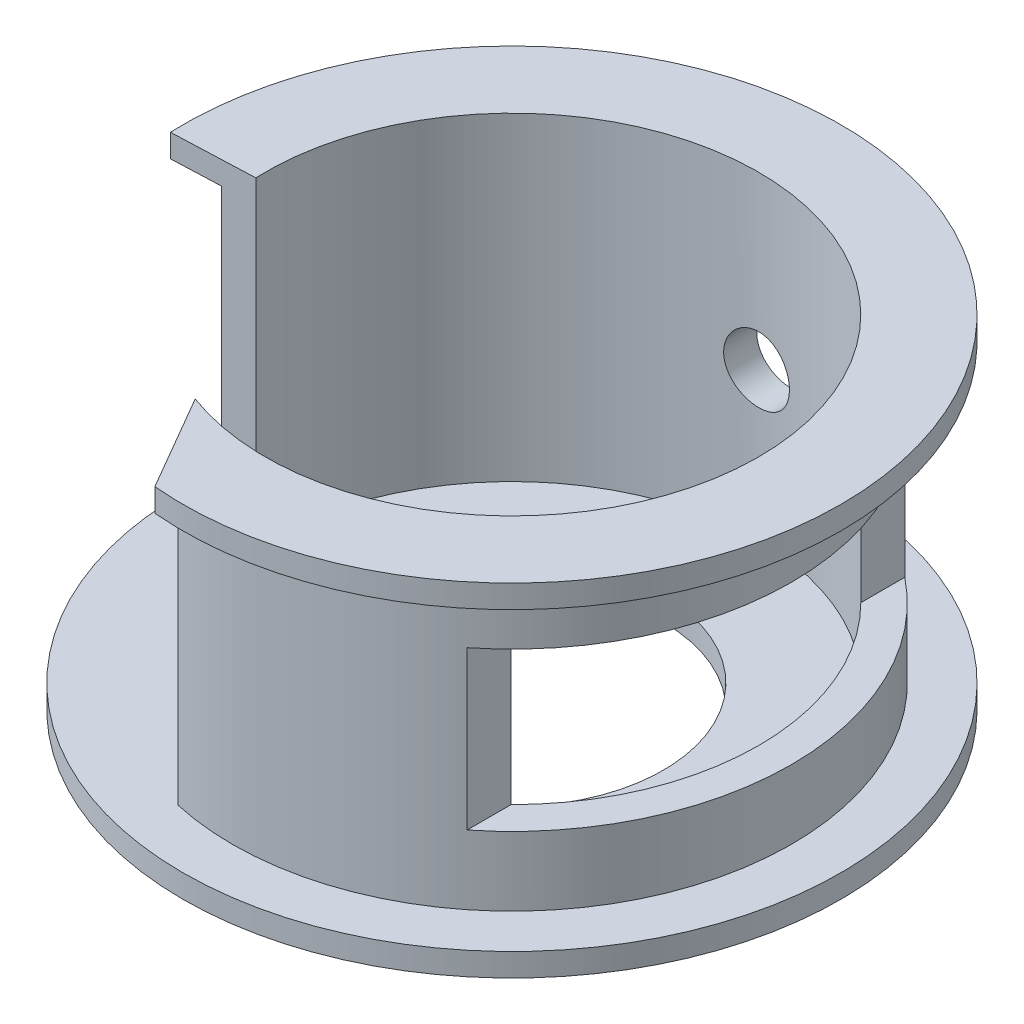
ISO-10303-21;
HEADER;
FILE_DESCRIPTION(('STEP AP214'),'2;1');
FILE_NAME('part.step','',(''),(''),'','','');
FILE_SCHEMA(('AUTOMOTIVE_DESIGN { 1 0 10303 214 1 1 1 1 }'));
ENDSEC;
DATA;
#1=APPLICATION_CONTEXT('core data for automotive mechanical design processes');
#2=APPLICATION_PROTOCOL_DEFINITION('international standard','automotive_design',2000,#1);
#3=PRODUCT_CONTEXT('',#1,'mechanical');
#4=PRODUCT('Part','Part','',(#3));
#5=PRODUCT_RELATED_PRODUCT_CATEGORY('part','',(#4));
#6=PRODUCT_DEFINITION_FORMATION('','',#4);
#7=PRODUCT_DEFINITION_CONTEXT('part definition',#1,'design');
#8=PRODUCT_DEFINITION('design','',#6,#7);
#9=PRODUCT_DEFINITION_SHAPE('','',#8);
#10=(LENGTH_UNIT() NAMED_UNIT(*) SI_UNIT(.MILLI.,.METRE.));
#11=(NAMED_UNIT(*) PLANE_ANGLE_UNIT() SI_UNIT($,.RADIAN.));
#12=(NAMED_UNIT(*) SI_UNIT($,.STERADIAN.) SOLID_ANGLE_UNIT());
#13=UNCERTAINTY_MEASURE_WITH_UNIT(LENGTH_MEASURE(1.E-05),#10,'distance_accuracy_value','');
#14=(GEOMETRIC_REPRESENTATION_CONTEXT(3) GLOBAL_UNCERTAINTY_ASSIGNED_CONTEXT((#13)) GLOBAL_UNIT_ASSIGNED_CONTEXT((#10,
#11,#12)) REPRESENTATION_CONTEXT('',''));
#15=CARTESIAN_POINT('',(0.,0.,0.));
#16=DIRECTION('',(0.,0.,1.));
#17=DIRECTION('',(1.,0.,0.));
#18=AXIS2_PLACEMENT_3D('',#15,#16,#17);
#19=CARTESIAN_POINT('',(-49.6227740453213,4.85,6.0186037827246));
#20=DIRECTION('',(0.,-1.,0.));
#21=DIRECTION('',(0.,0.,-1.));
#22=AXIS2_PLACEMENT_3D('',#19,#20,#21);
#23=CYLINDRICAL_SURFACE('',#22,4.25000000000001);
#24=DIRECTION('',(0.,-1.,0.));
#25=VECTOR('',#24,1.);
#26=CARTESIAN_POINT('',(-46.9777088050411,4.85,9.34518308805638));
#27=LINE('',#26,#25);
#28=CARTESIAN_POINT('',(-46.9777088050411,1.4,9.34518308805638));
#29=VERTEX_POINT('',#28);
#30=CARTESIAN_POINT('',(-46.9777088050411,3.8,9.34518308805638));
#31=VERTEX_POINT('',#30);
#32=EDGE_CURVE('E200',#29,#31,#27,.F.);
#33=ORIENTED_EDGE('',*,*,#32,.T.);
#34=CARTESIAN_POINT('',(-49.6227740453213,3.8,6.0186037827246));
#35=DIRECTION('',(0.,1.,0.));
#36=DIRECTION('',(0.,0.,1.));
#37=AXIS2_PLACEMENT_3D('',#34,#35,#36);
#38=CIRCLE('',#37,4.25000000000001);
#39=CARTESIAN_POINT('',(-46.9777088050411,3.8,2.69202447739283));
#40=VERTEX_POINT('',#39);
#41=EDGE_CURVE('E220',#31,#40,#38,.T.);
#42=ORIENTED_EDGE('',*,*,#41,.T.);
#43=DIRECTION('',(0.,-1.,0.));
#44=VECTOR('',#43,1.);
#45=CARTESIAN_POINT('',(-46.9777088050411,4.85,2.69202447739283));
#46=LINE('',#45,#44);
#47=CARTESIAN_POINT('',(-46.9777088050411,1.4,2.69202447739283));
#48=VERTEX_POINT('',#47);
#49=EDGE_CURVE('E217',#40,#48,#46,.T.);
#50=ORIENTED_EDGE('',*,*,#49,.T.);
#51=CARTESIAN_POINT('',(-49.6227740453213,1.4,6.0186037827246));
#52=DIRECTION('',(0.,1.,0.));
#53=DIRECTION('',(0.,0.,1.));
#54=AXIS2_PLACEMENT_3D('',#51,#52,#53);
#55=CIRCLE('',#54,4.25000000000001);
#56=EDGE_CURVE('E212',#29,#48,#55,.T.);
#57=ORIENTED_EDGE('',*,*,#56,.F.);
#58=EDGE_LOOP('',(#33,#42,#50,#57));
#59=FACE_BOUND('',#58,.T.);
#60=DIRECTION('',(0.,-1.,0.));
#61=VECTOR('',#60,1.);
#62=CARTESIAN_POINT('',(-50.5545924150655,4.85,10.165194493876));
#63=LINE('',#62,#61);
#64=CARTESIAN_POINT('',(-50.5545924150655,0.35,10.165194493876));
#65=VERTEX_POINT('',#64);
#66=CARTESIAN_POINT('',(-50.5545924150655,4.85,10.165194493876));
#67=VERTEX_POINT('',#66);
#68=EDGE_CURVE('E208',#65,#67,#63,.F.);
#69=ORIENTED_EDGE('',*,*,#68,.F.);
#70=CARTESIAN_POINT('',(-49.6227740453213,0.35,6.0186037827246));
#71=DIRECTION('',(0.,1.,0.));
#72=DIRECTION('',(0.,0.,1.));
#73=AXIS2_PLACEMENT_3D('',#70,#71,#72);
#74=CIRCLE('',#73,4.25000000000001);
#75=CARTESIAN_POINT('',(-53.8695061417575,0.35,6.1852366159187));
#76=VERTEX_POINT('',#75);
#77=EDGE_CURVE('E234',#65,#76,#74,.T.);
#78=ORIENTED_EDGE('',*,*,#77,.T.);
#79=DIRECTION('',(0.,-1.,0.));
#80=VECTOR('',#79,1.);
#81=CARTESIAN_POINT('',(-53.8695061417575,4.85,6.1852366159187));
#82=LINE('',#81,#80);
#83=CARTESIAN_POINT('',(-53.8695061417575,4.85,6.1852366159187));
#84=VERTEX_POINT('',#83);
#85=EDGE_CURVE('E140',#84,#76,#82,.T.);
#86=ORIENTED_EDGE('',*,*,#85,.F.);
#87=CARTESIAN_POINT('',(-49.6227740453213,4.85,6.0186037827246));
#88=DIRECTION('',(0.,1.,0.));
#89=DIRECTION('',(0.,0.,1.));
#90=AXIS2_PLACEMENT_3D('',#87,#88,#89);
#91=CIRCLE('',#90,4.25000000000001);
#92=EDGE_CURVE('E238',#67,#84,#91,.T.);
#93=ORIENTED_EDGE('',*,*,#92,.F.);
#94=EDGE_LOOP('',(#69,#78,#86,#93));
#95=FACE_BOUND('',#94,.T.);
#96=CARTESIAN_POINT('',(-50.1211400935394,2.6,1.79792477550509));
#97=CARTESIAN_POINT('',(-50.1211388964455,2.62798156670538,1.79792439509741));
#98=CARTESIAN_POINT('',(-50.1187832699592,2.65598094317943,1.79764442398657));
#99=CARTESIAN_POINT('',(-50.1094229075103,2.71120142448625,1.79655520055126));
#100=CARTESIAN_POINT('',(-50.1024132294114,2.73842166987362,1.79574538559905));
#101=CARTESIAN_POINT('',(-50.0839533994304,2.79127636042462,1.79368966404153));
#102=CARTESIAN_POINT('',(-50.0725061533573,2.81691183062037,1.79244404286284));
#103=CARTESIAN_POINT('',(-50.0455021312225,2.86589278743226,1.78965777455389));
#104=CARTESIAN_POINT('',(-50.0299460942458,2.88923868485963,1.78811718049675));
#105=CARTESIAN_POINT('',(-49.9950835702785,2.93309825790554,1.78490652151593));
#106=CARTESIAN_POINT('',(-49.9757608395914,2.953598983719,1.78323591537095));
#107=CARTESIAN_POINT('',(-49.9339483134657,2.99107448524386,1.77995901829016));
#108=CARTESIAN_POINT('',(-49.9114583653892,3.00804909092291,1.77835273045883));
#109=CARTESIAN_POINT('',(-49.8638695171569,3.03803610608421,1.77538070160866));
#110=CARTESIAN_POINT('',(-49.8387632839979,3.05103695421215,1.77401566726835));
#111=CARTESIAN_POINT('',(-49.7867052004623,3.07263329471565,1.77168670212908));
#112=CARTESIAN_POINT('',(-49.7597534112858,3.08122893309135,1.77072275803714));
#113=CARTESIAN_POINT('',(-49.7049023200967,3.09373216075166,1.76930928482792));
#114=CARTESIAN_POINT('',(-49.6770080080902,3.09766136862938,1.76885738397281));
#115=CARTESIAN_POINT('',(-49.6209525378693,3.10078727683943,1.76851177509801));
#116=CARTESIAN_POINT('',(-49.592791389005,3.09998414238909,1.76861804759115));
#117=CARTESIAN_POINT('',(-49.5371474433777,3.09368554040608,1.76937575921598));
#118=CARTESIAN_POINT('',(-49.5096619942383,3.08821313836785,1.7700245182299));
#119=CARTESIAN_POINT('',(-49.4560024483463,3.07276747012506,1.77179222962535));
#120=CARTESIAN_POINT('',(-49.42982837442,3.06279412560563,1.7729111901882));
#121=CARTESIAN_POINT('',(-49.3794611328486,3.03860427463275,1.77549914268959));
#122=CARTESIAN_POINT('',(-49.3552729520261,3.02437747905306,1.77696898164759));
#123=CARTESIAN_POINT('',(-49.3096187278496,2.99209206217626,1.78009482717716));
#124=CARTESIAN_POINT('',(-49.2881527954743,2.97403328473981,1.7817508413334));
#125=CARTESIAN_POINT('',(-49.2484158699745,2.93446602826488,1.78507608331743));
#126=CARTESIAN_POINT('',(-49.2301650491519,2.91293728602694,1.78674533036021));
#127=CARTESIAN_POINT('',(-49.197533053571,2.86711101182972,1.78989952342807));
#128=CARTESIAN_POINT('',(-49.1831518880008,2.84281347329642,1.79138446901552));
#129=CARTESIAN_POINT('',(-49.1586671066332,2.7921228909608,1.79400236232324));
#130=CARTESIAN_POINT('',(-49.1485648641116,2.7657291776355,1.79513519700617));
#131=CARTESIAN_POINT('',(-49.1329414206458,2.71160367044555,1.79691852746226));
#132=CARTESIAN_POINT('',(-49.1274200236129,2.68387193391039,1.79756904388152));
#133=CARTESIAN_POINT('',(-49.121141607089,2.62803632859877,1.79831054565642));
#134=CARTESIAN_POINT('',(-49.1203561053472,2.5999357051872,1.79840487590752));
#135=CARTESIAN_POINT('',(-49.1234967383997,2.54400325586424,1.7980321895262));
#136=CARTESIAN_POINT('',(-49.1274227839295,2.51617142487041,1.7975651835288));
#137=CARTESIAN_POINT('',(-49.1398511691961,2.46165105516719,1.7961253590766));
#138=CARTESIAN_POINT('',(-49.1483398468639,2.4349593587621,1.79515405096754));
#139=CARTESIAN_POINT('',(-49.1696384926664,2.38337836300969,1.79281601292121));
#140=CARTESIAN_POINT('',(-49.1824485966325,2.35848912034712,1.7914492705548));
#141=CARTESIAN_POINT('',(-49.2120967707017,2.31109058148161,1.78846591719097));
#142=CARTESIAN_POINT('',(-49.2289535496515,2.28859306122958,1.78684815833991));
#143=CARTESIAN_POINT('',(-49.266189978899,2.24673648396853,1.78354814231527));
#144=CARTESIAN_POINT('',(-49.2865697512347,2.22737753572604,1.78186588290893));
#145=CARTESIAN_POINT('',(-49.3303979326084,2.19224800738869,1.77861550581908));
#146=CARTESIAN_POINT('',(-49.3538613810926,2.17649612497319,1.77704801032022));
#147=CARTESIAN_POINT('',(-49.4031173818225,2.14915696006322,1.77421234740412));
#148=CARTESIAN_POINT('',(-49.4289098921275,2.13756960259467,1.7729441745983));
#149=CARTESIAN_POINT('',(-49.4820298756929,2.11891911964686,1.7708519868734));
#150=CARTESIAN_POINT('',(-49.5093535207753,2.11184521433279,1.77002691441516));
#151=CARTESIAN_POINT('',(-49.5648111149409,2.10238748990435,1.76890860835077));
#152=CARTESIAN_POINT('',(-49.5929450317264,2.10000348411145,1.768615353576));
#153=CARTESIAN_POINT('',(-49.6490425298429,2.09999654443786,1.76859295596488));
#154=CARTESIAN_POINT('',(-49.6770061106065,2.10234485651214,1.76886040662354));
#155=CARTESIAN_POINT('',(-49.7321385081036,2.11167529508503,1.76992164723604));
#156=CARTESIAN_POINT('',(-49.7593073251673,2.11865741965878,1.77071543697123));
#157=CARTESIAN_POINT('',(-49.8120750874979,2.13704828026223,1.7727396012217));
#158=CARTESIAN_POINT('',(-49.8376745236463,2.14845562387673,1.77396983839642));
#159=CARTESIAN_POINT('',(-49.8866002206707,2.17537016582407,1.77672956459788));
#160=CARTESIAN_POINT('',(-49.9099264675238,2.19087738944622,1.77825905547048));
#161=CARTESIAN_POINT('',(-49.9537896133389,2.22565757867586,1.78145664258483));
#162=CARTESIAN_POINT('',(-49.9743096075365,2.24495179576592,1.78312548898797));
#163=CARTESIAN_POINT('',(-50.0118322544799,2.28671459849814,1.78640701973318));
#164=CARTESIAN_POINT('',(-50.0288340697299,2.30918393783485,1.78801969062696));
#165=CARTESIAN_POINT('',(-50.0588869601394,2.35674697244112,1.79101166784557));
#166=CARTESIAN_POINT('',(-50.0719242130763,2.38184944810893,1.79239015048053));
#167=CARTESIAN_POINT('',(-50.0935801909538,2.43388885974119,1.79474756996055));
#168=CARTESIAN_POINT('',(-50.1022037765569,2.46082374051302,1.79572694608834));
#169=CARTESIAN_POINT('',(-50.1126959553758,2.50658524582692,1.79693428164283));
#170=CARTESIAN_POINT('',(-50.1158580273617,2.52512194778828,1.79730389283449));
#171=CARTESIAN_POINT('',(-50.1200804915823,2.5624364250665,1.79779926668373));
#172=CARTESIAN_POINT('',(-50.1211408972245,2.58121419884469,1.79792503089691));
#173=CARTESIAN_POINT('',(-50.1211400935394,2.6,1.79792477550509));
#174=B_SPLINE_CURVE_WITH_KNOTS('',3,(#96,#97,#98,#99,#100,#101,#102,#103,#104,#105,#106,#107,
#108,#109,#110,#111,#112,#113,#114,#115,#116,#117,#118,#119,#120,#121,#122,#123,#124,#125,#126,
#127,#128,#129,#130,#131,#132,#133,#134,#135,#136,#137,#138,#139,#140,#141,#142,#143,#144,#145,
#146,#147,#148,#149,#150,#151,#152,#153,#154,#155,#156,#157,#158,#159,#160,#161,#162,#163,#164,
#165,#166,#167,#168,#169,#170,#171,#172,#173),.UNSPECIFIED.,.T.,.F.,(4,2,2,2,2,2,2,2,2,2,2,2,2,
2,2,2,2,2,2,2,2,2,2,2,2,2,2,2,2,2,2,2,2,2,2,2,2,2,4),(0.,0.0838760829430994,0.167841376638751,
0.251751780792326,0.335647101499644,0.419912557239273,0.504182075384611,0.588694485577215,
0.673204094627054,0.757320641857373,0.84143425239642,0.925134743829644,1.00883669167932,
1.09274277626633,1.17665228037852,1.26107082646947,1.34548957300176,1.42993539235923,
1.5143775967246,1.5983114447186,1.68224370253551,1.76592602748241,1.84961098298448,
1.93369055097871,2.01777303210926,2.10228196766754,2.18678938173239,2.27109419697227,
2.35539565644379,2.43918643614964,2.52297718104945,2.60674158216928,2.6905064999855,
2.77475566230037,2.85902485695747,2.94358456915207,3.02805095636651,3.08436265201015,
3.14067398841408),.UNSPECIFIED.);
#175=CARTESIAN_POINT('',(-50.1211400935394,2.6,1.79792477550509));
#176=VERTEX_POINT('',#175);
#177=EDGE_CURVE('E273',#176,#176,#174,.T.);
#178=ORIENTED_EDGE('',*,*,#177,.F.);
#179=EDGE_LOOP('',(#178));
#180=FACE_BOUND('',#179,.T.);
#181=ADVANCED_FACE('F51',(#59,#95,#180),#23,.T.);
#182=CARTESIAN_POINT('',(-49.6227740453213,4.85,6.0186037827246));
#183=DIRECTION('',(0.,-1.,0.));
#184=DIRECTION('',(0.,0.,-1.));
#185=AXIS2_PLACEMENT_3D('',#182,#183,#184);
#186=CYLINDRICAL_SURFACE('',#185,3.75000000000001);
#187=CARTESIAN_POINT('',(-49.6227740453213,0.35,6.0186037827246));
#188=DIRECTION('',(0.,1.,0.));
#189=DIRECTION('',(0.,0.,1.));
#190=AXIS2_PLACEMENT_3D('',#187,#188,#189);
#191=CIRCLE('',#190,3.75000000000001);
#192=CARTESIAN_POINT('',(-53.3698906010003,0.35,6.16563275318998));
#193=VERTEX_POINT('',#192);
#194=CARTESIAN_POINT('',(-50.9188461799765,0.35,9.53750943956883));
#195=VERTEX_POINT('',#194);
#196=EDGE_CURVE('E151',#193,#195,#191,.F.);
#197=ORIENTED_EDGE('',*,*,#196,.T.);
#198=DIRECTION('',(0.,1.,0.));
#199=VECTOR('',#198,1.);
#200=CARTESIAN_POINT('',(-50.9188461799765,0.35,9.53750943956883));
#201=LINE('',#200,#199);
#202=CARTESIAN_POINT('',(-50.9188461799765,5.2,9.53750943956883));
#203=VERTEX_POINT('',#202);
#204=EDGE_CURVE('E143',#195,#203,#201,.T.);
#205=ORIENTED_EDGE('',*,*,#204,.T.);
#206=CARTESIAN_POINT('',(-49.6227740453213,5.2,6.0186037827246));
#207=DIRECTION('',(0.,1.,0.));
#208=DIRECTION('',(0.,0.,1.));
#209=AXIS2_PLACEMENT_3D('',#206,#207,#208);
#210=CIRCLE('',#209,3.75000000000001);
#211=CARTESIAN_POINT('',(-53.3698906010003,5.2,6.16563275318998));
#212=VERTEX_POINT('',#211);
#213=EDGE_CURVE('E153',#203,#212,#210,.T.);
#214=ORIENTED_EDGE('',*,*,#213,.T.);
#215=DIRECTION('',(0.,1.,0.));
#216=VECTOR('',#215,1.);
#217=CARTESIAN_POINT('',(-53.3698906010003,0.35,6.16563275318998));
#218=LINE('',#217,#216);
#219=EDGE_CURVE('E137',#193,#212,#218,.T.);
#220=ORIENTED_EDGE('',*,*,#219,.F.);
#221=EDGE_LOOP('',(#197,#205,#214,#220));
#222=FACE_BOUND('',#221,.T.);
#223=CARTESIAN_POINT('',(-49.6227740453213,3.8,6.0186037827246));
#224=DIRECTION('',(0.,1.,0.));
#225=DIRECTION('',(0.,0.,1.));
#226=AXIS2_PLACEMENT_3D('',#223,#224,#225);
#227=CIRCLE('',#226,3.75000000000001);
#228=CARTESIAN_POINT('',(-46.9777088050411,3.8,8.67682308794786));
#229=VERTEX_POINT('',#228);
#230=CARTESIAN_POINT('',(-46.9777088050411,3.8,3.36038447750135));
#231=VERTEX_POINT('',#230);
#232=EDGE_CURVE('E12',#229,#231,#227,.T.);
#233=ORIENTED_EDGE('',*,*,#232,.F.);
#234=DIRECTION('',(0.,-1.,0.));
#235=VECTOR('',#234,1.);
#236=CARTESIAN_POINT('',(-46.9777088050411,4.85,8.67682308794786));
#237=LINE('',#236,#235);
#238=CARTESIAN_POINT('',(-46.9777088050411,1.4,8.67682308794786));
#239=VERTEX_POINT('',#238);
#240=EDGE_CURVE('E166',#239,#229,#237,.F.);
#241=ORIENTED_EDGE('',*,*,#240,.F.);
#242=CARTESIAN_POINT('',(-49.6227740453213,1.4,6.0186037827246));
#243=DIRECTION('',(0.,1.,0.));
#244=DIRECTION('',(0.,0.,1.));
#245=AXIS2_PLACEMENT_3D('',#242,#243,#244);
#246=CIRCLE('',#245,3.75000000000001);
#247=CARTESIAN_POINT('',(-46.9777088050411,1.4,3.36038447750135));
#248=VERTEX_POINT('',#247);
#249=EDGE_CURVE('E160',#239,#248,#246,.T.);
#250=ORIENTED_EDGE('',*,*,#249,.T.);
#251=DIRECTION('',(0.,-1.,0.));
#252=VECTOR('',#251,1.);
#253=CARTESIAN_POINT('',(-46.9777088050411,4.85,3.36038447750135));
#254=LINE('',#253,#252);
#255=EDGE_CURVE('E66',#231,#248,#254,.T.);
#256=ORIENTED_EDGE('',*,*,#255,.F.);
#257=EDGE_LOOP('',(#233,#241,#250,#256));
#258=FACE_BOUND('',#257,.T.);
#259=CARTESIAN_POINT('',(-50.1211400935394,2.6,2.30186713857244));
#260=CARTESIAN_POINT('',(-50.1211389151966,2.6279520108603,2.30186671462601));
#261=CARTESIAN_POINT('',(-50.1187882365882,2.65592110227072,2.30154944284697));
#262=CARTESIAN_POINT('',(-50.1094486936465,2.71107980505658,2.30031531607637));
#263=CARTESIAN_POINT('',(-50.1024550839288,2.73826858921525,2.29939784765795));
#264=CARTESIAN_POINT('',(-50.0840404194912,2.79106017833969,2.29706929985386));
#265=CARTESIAN_POINT('',(-50.0726224851241,2.8166640863475,2.29565856842116));
#266=CARTESIAN_POINT('',(-50.045690148999,2.86558807973306,2.29250328284264));
#267=CARTESIAN_POINT('',(-50.0301764054277,2.88890853123203,2.29075878234508));
#268=CARTESIAN_POINT('',(-49.9953879980248,2.93275525296693,2.2871207603201));
#269=CARTESIAN_POINT('',(-49.9760926133458,2.95326501986763,2.28522645370699));
#270=CARTESIAN_POINT('',(-49.9343332814444,2.99076543197651,2.28151007531922));
#271=CARTESIAN_POINT('',(-49.9118691725712,3.00775589754022,2.27968800723586));
#272=CARTESIAN_POINT('',(-49.864306344825,3.03779468443482,2.27631413827661));
#273=CARTESIAN_POINT('',(-49.8391981284975,3.05082809338158,2.27476336888033));
#274=CARTESIAN_POINT('',(-49.7871250740251,3.07248710864644,2.27211641239256));
#275=CARTESIAN_POINT('',(-49.7601603141413,3.08111290063504,2.27102020615299));
#276=CARTESIAN_POINT('',(-49.705310112481,3.09366201967094,2.26941243954968));
#277=CARTESIAN_POINT('',(-49.6774311128773,3.0976130561837,2.26889743498053));
#278=CARTESIAN_POINT('',(-49.6214014212377,3.1007865792582,2.26849941498346));
#279=CARTESIAN_POINT('',(-49.5932507412661,3.10000927483399,2.26861637161997));
#280=CARTESIAN_POINT('',(-49.5376639627132,3.09377025786257,2.26946729744685));
#281=CARTESIAN_POINT('',(-49.5102244776239,3.08833811332933,2.27019737147065));
#282=CARTESIAN_POINT('',(-49.4566502106328,3.07299003627458,2.27218923981854));
#283=CARTESIAN_POINT('',(-49.4305154567998,3.0630740073374,2.27345104557628));
#284=CARTESIAN_POINT('',(-49.3801995648099,3.03900776032899,2.27637244981885));
#285=CARTESIAN_POINT('',(-49.3560247120226,3.02484455495021,2.27803326528045));
#286=CARTESIAN_POINT('',(-49.3103836892616,2.99269546629325,2.28156791706812));
#287=CARTESIAN_POINT('',(-49.288917661027,2.97470938311515,2.28344176453134));
#288=CARTESIAN_POINT('',(-49.2491282319096,2.93525829605044,2.28721099445868));
#289=CARTESIAN_POINT('',(-49.2308306135087,2.91376728397405,2.28910643097042));
#290=CARTESIAN_POINT('',(-49.1980981426176,2.8680053947996,2.29269149696412));
#291=CARTESIAN_POINT('',(-49.1836633047084,2.84373450720877,2.2943811256692));
#292=CARTESIAN_POINT('',(-49.1590646005676,2.79307860206708,2.29736367956865));
#293=CARTESIAN_POINT('',(-49.1489028224093,2.76669255840489,2.29865641073201));
#294=CARTESIAN_POINT('',(-49.133161811128,2.71256733980498,2.3006953058));
#295=CARTESIAN_POINT('',(-49.1275823238206,2.68482824001311,2.30144150002135));
#296=CARTESIAN_POINT('',(-49.1211989704825,2.62901374278629,2.3022974301501));
#297=CARTESIAN_POINT('',(-49.1203585496954,2.60094259795307,2.30241203764082));
#298=CARTESIAN_POINT('',(-49.1233805668057,2.54505989866844,2.30200474768835));
#299=CARTESIAN_POINT('',(-49.1272428895426,2.51724833787715,2.30148286583147));
#300=CARTESIAN_POINT('',(-49.1395299566415,2.46278475741031,2.29986570248506));
#301=CARTESIAN_POINT('',(-49.1479368769516,2.4361286443147,2.29877266165376));
#302=CARTESIAN_POINT('',(-49.1690560715684,2.38460426488183,2.29613785590929));
#303=CARTESIAN_POINT('',(-49.1817685173575,2.35973606980246,2.29459607312374));
#304=CARTESIAN_POINT('',(-49.2112269548803,2.31232880040082,2.29122544469352));
#305=CARTESIAN_POINT('',(-49.2279967803717,2.28980465709672,2.2893949259393));
#306=CARTESIAN_POINT('',(-49.2650603889288,2.2478775418161,2.28565762814116));
#307=CARTESIAN_POINT('',(-49.2853543295631,2.22847470947312,2.2837508456903));
#308=CARTESIAN_POINT('',(-49.3290503328005,2.19321149879059,2.28006003676669));
#309=CARTESIAN_POINT('',(-49.3524719416436,2.1773752343872,2.27827689920379));
#310=CARTESIAN_POINT('',(-49.4016639348582,2.14986183557175,2.27504704635353));
#311=CARTESIAN_POINT('',(-49.4274342668721,2.13818460847503,2.27360032356937));
#312=CARTESIAN_POINT('',(-49.480515019867,2.11935963318402,2.2712092907869));
#313=CARTESIAN_POINT('',(-49.507820593368,2.11219841406884,2.27026348794593));
#314=CARTESIAN_POINT('',(-49.5632601907741,2.10256518564769,2.268973608166));
#315=CARTESIAN_POINT('',(-49.5913941717081,2.10009293354941,2.26862950007167));
#316=CARTESIAN_POINT('',(-49.6474581421567,2.09991291808314,2.26858105120731));
#317=CARTESIAN_POINT('',(-49.6753880159333,2.1021682389315,2.26887175418419));
#318=CARTESIAN_POINT('',(-49.7304680771547,2.11130100991402,2.27004925069771));
#319=CARTESIAN_POINT('',(-49.7576182659357,2.11817845212651,2.27093604321275));
#320=CARTESIAN_POINT('',(-49.8103601963518,2.13634778638291,2.27320548389206));
#321=CARTESIAN_POINT('',(-49.8359527240316,2.14763743018314,2.27458787949147));
#322=CARTESIAN_POINT('',(-49.8848859686813,2.17430690148608,2.27769491386198));
#323=CARTESIAN_POINT('',(-49.9082266445823,2.18968680356669,2.2794195588732));
#324=CARTESIAN_POINT('',(-49.9521803949902,2.2242348053358,2.28303392958083));
#325=CARTESIAN_POINT('',(-49.9727719979714,2.24343010607265,2.28492478284778));
#326=CARTESIAN_POINT('',(-50.0104558686444,2.28500713722485,2.28864904636827));
#327=CARTESIAN_POINT('',(-50.027547309151,2.30738961874526,2.29048244295669));
#328=CARTESIAN_POINT('',(-50.0578114908178,2.35482002243566,2.29389223938027));
#329=CARTESIAN_POINT('',(-50.070966599987,2.37987927489756,2.29546746898657));
#330=CARTESIAN_POINT('',(-50.0928627097426,2.4318589355152,2.29816839957442));
#331=CARTESIAN_POINT('',(-50.1016084404064,2.45877731392021,2.29929458199034));
#332=CARTESIAN_POINT('',(-50.1123780135959,2.50485785837602,2.30070030734142));
#333=CARTESIAN_POINT('',(-50.11565897696,2.52373119641663,2.30113564148204));
#334=CARTESIAN_POINT('',(-50.1200404104307,2.5617336890911,2.30171920092356));
#335=CARTESIAN_POINT('',(-50.121140900284,2.58086284140666,2.30186742882454));
#336=CARTESIAN_POINT('',(-50.1211400935394,2.6,2.30186713857244));
#337=B_SPLINE_CURVE_WITH_KNOTS('',3,(#259,#260,#261,#262,#263,#264,#265,#266,#267,#268,#269,
#270,#271,#272,#273,#274,#275,#276,#277,#278,#279,#280,#281,#282,#283,#284,#285,#286,#287,#288,
#289,#290,#291,#292,#293,#294,#295,#296,#297,#298,#299,#300,#301,#302,#303,#304,#305,#306,#307,
#308,#309,#310,#311,#312,#313,#314,#315,#316,#317,#318,#319,#320,#321,#322,#323,#324,#325,#326,
#327,#328,#329,#330,#331,#332,#333,#334,#335,#336),.UNSPECIFIED.,.T.,.F.,(4,2,2,2,2,2,2,2,2,2,2,
2,2,2,2,2,2,2,2,2,2,2,2,2,2,2,2,2,2,2,2,2,2,2,2,2,2,2,4),(0.,0.0837861130459666,
0.167657993181496,0.251470828169377,0.335270202827333,0.419542270061261,0.503818637944873,
0.588408772564847,0.672995343538438,0.757077977593079,0.841156894842045,0.92470566011824,
1.00825622200489,1.09206492193822,1.17587800534293,1.26034396297329,1.34481023943494,
1.42931774335409,1.51382055923895,1.59767066220612,1.68151871189942,1.76504026793901,
1.84856515090673,1.93259312305632,2.0166248531978,2.10120872695184,2.18579071562591,
2.27011919391793,2.35444330560543,2.43811141669216,2.52177938438378,2.60540477441063,
2.6890316892883,2.77327769205354,2.85754358156189,2.94218145907335,3.02672834868838,
3.08409247402628,3.14145607986108),.UNSPECIFIED.);
#338=CARTESIAN_POINT('',(-50.1211400935394,2.6,2.30186713857244));
#339=VERTEX_POINT('',#338);
#340=EDGE_CURVE('E55',#339,#339,#337,.T.);
#341=ORIENTED_EDGE('',*,*,#340,.T.);
#342=EDGE_LOOP('',(#341));
#343=FACE_BOUND('',#342,.T.);
#344=ADVANCED_FACE('F148',(#222,#258,#343),#186,.F.);
#345=CARTESIAN_POINT('',(-49.6227740453213,5.2,6.0186037827246));
#346=DIRECTION('',(0.,1.,0.));
#347=DIRECTION('',(0.,0.,1.));
#348=AXIS2_PLACEMENT_3D('',#345,#346,#347);
#349=PLANE('',#348);
#350=ORIENTED_EDGE('',*,*,#213,.F.);
#351=DIRECTION('',(0.501920615587482,0.,0.864913692600761));
#352=VECTOR('',#351,1.);
#353=CARTESIAN_POINT('',(-42.231555924761,5.2,24.5075187597447));
#354=LINE('',#353,#352);
#355=CARTESIAN_POINT('',(-50.0710320086338,5.2,10.9984697245273));
#356=VERTEX_POINT('',#355);
#357=EDGE_CURVE('E270',#203,#356,#354,.T.);
#358=ORIENTED_EDGE('',*,*,#357,.T.);
#359=CARTESIAN_POINT('',(-49.6227740453213,5.2,6.0186037827246));
#360=DIRECTION('',(0.,1.,0.));
#361=DIRECTION('',(0.,0.,1.));
#362=AXIS2_PLACEMENT_3D('',#359,#360,#361);
#363=CIRCLE('',#362,5.);
#364=CARTESIAN_POINT('',(-54.6189294528933,5.2,6.21464241001177));
#365=VERTEX_POINT('',#364);
#366=EDGE_CURVE('E230',#356,#365,#363,.T.);
#367=ORIENTED_EDGE('',*,*,#366,.T.);
#368=DIRECTION('',(0.999231081514409,0.,-0.0392077254574332));
#369=VECTOR('',#368,1.);
#370=CARTESIAN_POINT('',(0.159511920835361,5.2,4.06525161332819));
#371=LINE('',#370,#369);
#372=EDGE_CURVE('E267',#365,#212,#371,.T.);
#373=ORIENTED_EDGE('',*,*,#372,.T.);
#374=EDGE_LOOP('',(#350,#358,#367,#373));
#375=FACE_BOUND('',#374,.T.);
#376=ADVANCED_FACE('F309',(#375),#349,.T.);
#377=CARTESIAN_POINT('',(-49.6227740453213,4.85,6.0186037827246));
#378=DIRECTION('',(0.,1.,0.));
#379=DIRECTION('',(0.,0.,1.));
#380=AXIS2_PLACEMENT_3D('',#377,#378,#379);
#381=PLANE('',#380);
#382=DIRECTION('',(0.501920615587482,0.,0.864913692600761));
#383=VECTOR('',#382,1.);
#384=CARTESIAN_POINT('',(-52.1199544408187,4.85,7.46774990223181));
#385=LINE('',#384,#383);
#386=CARTESIAN_POINT('',(-50.0710320086338,4.85,10.9984697245273));
#387=VERTEX_POINT('',#386);
#388=EDGE_CURVE('E250',#67,#387,#385,.T.);
#389=ORIENTED_EDGE('',*,*,#388,.F.);
#390=ORIENTED_EDGE('',*,*,#92,.T.);
#391=DIRECTION('',(0.999231081514409,0.,-0.0392077254574332));
#392=VECTOR('',#391,1.);
#393=CARTESIAN_POINT('',(-49.6227740453213,4.85,6.0186037827246));
#394=LINE('',#393,#392);
#395=CARTESIAN_POINT('',(-54.6189294528933,4.85,6.21464241001177));
#396=VERTEX_POINT('',#395);
#397=EDGE_CURVE('E254',#396,#84,#394,.T.);
#398=ORIENTED_EDGE('',*,*,#397,.F.);
#399=CARTESIAN_POINT('',(-49.6227740453213,4.85,6.0186037827246));
#400=DIRECTION('',(0.,1.,0.));
#401=DIRECTION('',(0.,0.,1.));
#402=AXIS2_PLACEMENT_3D('',#399,#400,#401);
#403=CIRCLE('',#402,5.);
#404=EDGE_CURVE('E229',#387,#396,#403,.T.);
#405=ORIENTED_EDGE('',*,*,#404,.F.);
#406=EDGE_LOOP('',(#389,#390,#398,#405));
#407=FACE_BOUND('',#406,.T.);
#408=ADVANCED_FACE('F312',(#407),#381,.F.);
#409=CARTESIAN_POINT('',(-49.6227740453213,5.2,6.0186037827246));
#410=DIRECTION('',(0.,-1.,0.));
#411=DIRECTION('',(0.,0.,-1.));
#412=AXIS2_PLACEMENT_3D('',#409,#410,#411);
#413=CYLINDRICAL_SURFACE('',#412,5.);
#414=DIRECTION('',(0.,1.,0.));
#415=VECTOR('',#414,1.);
#416=CARTESIAN_POINT('',(-50.0710320086338,0.35,10.9984697245273));
#417=LINE('',#416,#415);
#418=EDGE_CURVE('E259',#387,#356,#417,.T.);
#419=ORIENTED_EDGE('',*,*,#418,.F.);
#420=ORIENTED_EDGE('',*,*,#404,.T.);
#421=DIRECTION('',(0.,1.,0.));
#422=VECTOR('',#421,1.);
#423=CARTESIAN_POINT('',(-54.6189294528933,0.35,6.21464241001177));
#424=LINE('',#423,#422);
#425=EDGE_CURVE('E155',#396,#365,#424,.T.);
#426=ORIENTED_EDGE('',*,*,#425,.T.);
#427=ORIENTED_EDGE('',*,*,#366,.F.);
#428=EDGE_LOOP('',(#419,#420,#426,#427));
#429=FACE_BOUND('',#428,.T.);
#430=ADVANCED_FACE('F316',(#429),#413,.T.);
#431=CARTESIAN_POINT('',(-49.6227740453213,0.35,6.0186037827246));
#432=DIRECTION('',(0.,-1.,0.));
#433=DIRECTION('',(0.,0.,-1.));
#434=AXIS2_PLACEMENT_3D('',#431,#432,#433);
#435=CYLINDRICAL_SURFACE('',#434,5.);
#436=CARTESIAN_POINT('',(-49.6227740453213,0.35,6.0186037827246));
#437=DIRECTION('',(0.,1.,0.));
#438=DIRECTION('',(0.,0.,1.));
#439=AXIS2_PLACEMENT_3D('',#436,#437,#438);
#440=CIRCLE('',#439,5.);
#441=CARTESIAN_POINT('',(-49.6227740453213,0.35,11.0186037827246));
#442=VERTEX_POINT('',#441);
#443=EDGE_CURVE('E161',#442,#442,#440,.T.);
#444=ORIENTED_EDGE('',*,*,#443,.F.);
#445=EDGE_LOOP('',(#444));
#446=FACE_BOUND('',#445,.T.);
#447=CARTESIAN_POINT('',(-49.6227740453213,0.,6.0186037827246));
#448=DIRECTION('',(0.,1.,0.));
#449=DIRECTION('',(0.,0.,1.));
#450=AXIS2_PLACEMENT_3D('',#447,#448,#449);
#451=CIRCLE('',#450,5.);
#452=CARTESIAN_POINT('',(-49.6227740453213,0.,11.0186037827246));
#453=VERTEX_POINT('',#452);
#454=EDGE_CURVE('E169',#453,#453,#451,.T.);
#455=ORIENTED_EDGE('',*,*,#454,.T.);
#456=EDGE_LOOP('',(#455));
#457=FACE_BOUND('',#456,.T.);
#458=ADVANCED_FACE('F53',(#446,#457),#435,.T.);
#459=CARTESIAN_POINT('',(-49.6227740453213,0.35,6.0186037827246));
#460=DIRECTION('',(0.,1.,0.));
#461=DIRECTION('',(0.,0.,1.));
#462=AXIS2_PLACEMENT_3D('',#459,#460,#461);
#463=PLANE('',#462);
#464=ORIENTED_EDGE('',*,*,#443,.T.);
#465=EDGE_LOOP('',(#464));
#466=FACE_BOUND('',#465,.T.);
#467=ORIENTED_EDGE('',*,*,#77,.F.);
#468=DIRECTION('',(0.501920615587482,0.,0.864913692600761));
#469=VECTOR('',#468,1.);
#470=CARTESIAN_POINT('',(-42.231555924761,0.35,24.5075187597447));
#471=LINE('',#470,#469);
#472=EDGE_CURVE('E73',#195,#65,#471,.T.);
#473=ORIENTED_EDGE('',*,*,#472,.F.);
#474=ORIENTED_EDGE('',*,*,#196,.F.);
#475=DIRECTION('',(0.999231081514409,0.,-0.0392077254574332));
#476=VECTOR('',#475,1.);
#477=CARTESIAN_POINT('',(0.159511920835361,0.35,4.06525161332819));
#478=LINE('',#477,#476);
#479=EDGE_CURVE('E134',#76,#193,#478,.T.);
#480=ORIENTED_EDGE('',*,*,#479,.F.);
#481=EDGE_LOOP('',(#467,#473,#474,#480));
#482=FACE_BOUND('',#481,.T.);
#483=CARTESIAN_POINT('',(-49.6227740453213,0.35,6.0186037827246));
#484=DIRECTION('',(0.,1.,0.));
#485=DIRECTION('',(0.,0.,1.));
#486=AXIS2_PLACEMENT_3D('',#483,#484,#485);
#487=CIRCLE('',#486,2.3);
#488=CARTESIAN_POINT('',(-49.6227740453213,0.35,8.3186037827246));
#489=VERTEX_POINT('',#488);
#490=EDGE_CURVE('E176',#489,#489,#487,.T.);
#491=ORIENTED_EDGE('',*,*,#490,.F.);
#492=EDGE_LOOP('',(#491));
#493=FACE_BOUND('',#492,.T.);
#494=ADVANCED_FACE('F157',(#466,#482,#493),#463,.T.);
#495=CARTESIAN_POINT('',(-49.6227740453213,0.,6.0186037827246));
#496=DIRECTION('',(0.,1.,0.));
#497=DIRECTION('',(0.,0.,1.));
#498=AXIS2_PLACEMENT_3D('',#495,#496,#497);
#499=PLANE('',#498);
#500=CARTESIAN_POINT('',(-49.6227740453213,0.,6.0186037827246));
#501=DIRECTION('',(0.,1.,0.));
#502=DIRECTION('',(0.,0.,1.));
#503=AXIS2_PLACEMENT_3D('',#500,#501,#502);
#504=CIRCLE('',#503,2.3);
#505=CARTESIAN_POINT('',(-49.6227740453213,0.,8.3186037827246));
#506=VERTEX_POINT('',#505);
#507=EDGE_CURVE('E173',#506,#506,#504,.T.);
#508=ORIENTED_EDGE('',*,*,#507,.T.);
#509=EDGE_LOOP('',(#508));
#510=FACE_BOUND('',#509,.T.);
#511=ORIENTED_EDGE('',*,*,#454,.F.);
#512=EDGE_LOOP('',(#511));
#513=FACE_BOUND('',#512,.T.);
#514=ADVANCED_FACE('F307',(#510,#513),#499,.F.);
#515=CARTESIAN_POINT('',(-49.6227740453213,-11.05,6.0186037827246));
#516=DIRECTION('',(0.,1.,0.));
#517=DIRECTION('',(0.,0.,1.));
#518=AXIS2_PLACEMENT_3D('',#515,#516,#517);
#519=CYLINDRICAL_SURFACE('',#518,2.3);
#520=ORIENTED_EDGE('',*,*,#490,.T.);
#521=EDGE_LOOP('',(#520));
#522=FACE_BOUND('',#521,.T.);
#523=ORIENTED_EDGE('',*,*,#507,.F.);
#524=EDGE_LOOP('',(#523));
#525=FACE_BOUND('',#524,.T.);
#526=ADVANCED_FACE('F303',(#522,#525),#519,.F.);
#527=CARTESIAN_POINT('',(0.,3.8,11.4));
#528=DIRECTION('',(0.,1.,0.));
#529=DIRECTION('',(0.,0.,1.));
#530=AXIS2_PLACEMENT_3D('',#527,#528,#529);
#531=PLANE('',#530);
#532=DIRECTION('',(0.,0.,-1.));
#533=VECTOR('',#532,1.);
#534=CARTESIAN_POINT('',(-46.9777088050411,3.8,11.4));
#535=LINE('',#534,#533);
#536=EDGE_CURVE('E206',#31,#229,#535,.T.);
#537=ORIENTED_EDGE('',*,*,#536,.T.);
#538=ORIENTED_EDGE('',*,*,#232,.T.);
#539=EDGE_CURVE('E190',#231,#40,#535,.T.);
#540=ORIENTED_EDGE('',*,*,#539,.T.);
#541=ORIENTED_EDGE('',*,*,#41,.F.);
#542=EDGE_LOOP('',(#537,#538,#540,#541));
#543=FACE_BOUND('',#542,.T.);
#544=ADVANCED_FACE('F300',(#543),#531,.F.);
#545=CARTESIAN_POINT('',(-46.9777088050411,0.,11.4));
#546=DIRECTION('',(-1.,0.,0.));
#547=DIRECTION('',(0.,0.,1.));
#548=AXIS2_PLACEMENT_3D('',#545,#546,#547);
#549=PLANE('',#548);
#550=ORIENTED_EDGE('',*,*,#539,.F.);
#551=ORIENTED_EDGE('',*,*,#255,.T.);
#552=DIRECTION('',(0.,0.,-1.));
#553=VECTOR('',#552,1.);
#554=CARTESIAN_POINT('',(-46.9777088050411,1.4,11.4));
#555=LINE('',#554,#553);
#556=EDGE_CURVE('E187',#248,#48,#555,.T.);
#557=ORIENTED_EDGE('',*,*,#556,.T.);
#558=ORIENTED_EDGE('',*,*,#49,.F.);
#559=EDGE_LOOP('',(#550,#551,#557,#558));
#560=FACE_BOUND('',#559,.T.);
#561=ADVANCED_FACE('F186',(#560),#549,.F.);
#562=EDGE_CURVE('E81',#29,#239,#555,.T.);
#563=ORIENTED_EDGE('',*,*,#562,.T.);
#564=ORIENTED_EDGE('',*,*,#240,.T.);
#565=ORIENTED_EDGE('',*,*,#536,.F.);
#566=ORIENTED_EDGE('',*,*,#32,.F.);
#567=EDGE_LOOP('',(#563,#564,#565,#566));
#568=FACE_BOUND('',#567,.T.);
#569=ADVANCED_FACE('F196',(#568),#549,.F.);
#570=CARTESIAN_POINT('',(0.,1.4,11.4));
#571=DIRECTION('',(0.,1.,0.));
#572=DIRECTION('',(0.,0.,1.));
#573=AXIS2_PLACEMENT_3D('',#570,#571,#572);
#574=PLANE('',#573);
#575=ORIENTED_EDGE('',*,*,#56,.T.);
#576=ORIENTED_EDGE('',*,*,#556,.F.);
#577=ORIENTED_EDGE('',*,*,#249,.F.);
#578=ORIENTED_EDGE('',*,*,#562,.F.);
#579=EDGE_LOOP('',(#575,#576,#577,#578));
#580=FACE_BOUND('',#579,.T.);
#581=ADVANCED_FACE('F194',(#580),#574,.T.);
#582=CARTESIAN_POINT('',(-42.231555924761,0.35,24.5075187597447));
#583=DIRECTION('',(-0.864913692600761,0.,0.501920615587482));
#584=DIRECTION('',(0.501920615587482,0.,0.864913692600761));
#585=AXIS2_PLACEMENT_3D('',#582,#583,#584);
#586=PLANE('',#585);
#587=ORIENTED_EDGE('',*,*,#68,.T.);
#588=ORIENTED_EDGE('',*,*,#388,.T.);
#589=ORIENTED_EDGE('',*,*,#418,.T.);
#590=ORIENTED_EDGE('',*,*,#357,.F.);
#591=ORIENTED_EDGE('',*,*,#204,.F.);
#592=ORIENTED_EDGE('',*,*,#472,.T.);
#593=EDGE_LOOP('',(#587,#588,#589,#590,#591,#592));
#594=FACE_BOUND('',#593,.T.);
#595=ADVANCED_FACE('F293',(#594),#586,.T.);
#596=CARTESIAN_POINT('',(0.159511920835361,0.35,4.06525161332819));
#597=DIRECTION('',(0.0392077254574332,0.,0.999231081514409));
#598=DIRECTION('',(0.999231081514409,0.,-0.0392077254574332));
#599=AXIS2_PLACEMENT_3D('',#596,#597,#598);
#600=PLANE('',#599);
#601=ORIENTED_EDGE('',*,*,#85,.T.);
#602=ORIENTED_EDGE('',*,*,#479,.T.);
#603=ORIENTED_EDGE('',*,*,#219,.T.);
#604=ORIENTED_EDGE('',*,*,#372,.F.);
#605=ORIENTED_EDGE('',*,*,#425,.F.);
#606=ORIENTED_EDGE('',*,*,#397,.T.);
#607=EDGE_LOOP('',(#601,#602,#603,#604,#605,#606));
#608=FACE_BOUND('',#607,.T.);
#609=ADVANCED_FACE('F136',(#608),#600,.T.);
#610=CARTESIAN_POINT('',(-49.6211400935394,2.6,4.85));
#611=DIRECTION('',(0.,0.,-1.));
#612=DIRECTION('',(-1.,0.,0.));
#613=AXIS2_PLACEMENT_3D('',#610,#611,#612);
#614=CYLINDRICAL_SURFACE('',#613,0.499999999999999);
#615=ORIENTED_EDGE('',*,*,#340,.F.);
#616=EDGE_LOOP('',(#615));
#617=FACE_BOUND('',#616,.T.);
#618=ORIENTED_EDGE('',*,*,#177,.T.);
#619=EDGE_LOOP('',(#618));
#620=FACE_BOUND('',#619,.T.);
#621=ADVANCED_FACE('F285',(#617,#620),#614,.F.);
#622=CLOSED_SHELL('',(#181,#344,#376,#408,#430,#458,#494,#514,#526,#544,#561,#569,#581,#595,
#609,#621));
#623=MANIFOLD_SOLID_BREP('B2',#622);
#624=ADVANCED_BREP_SHAPE_REPRESENTATION('',(#18,#623),#14);
#625=SHAPE_DEFINITION_REPRESENTATION(#9,#624);
ENDSEC;
END-ISO-10303-21;
